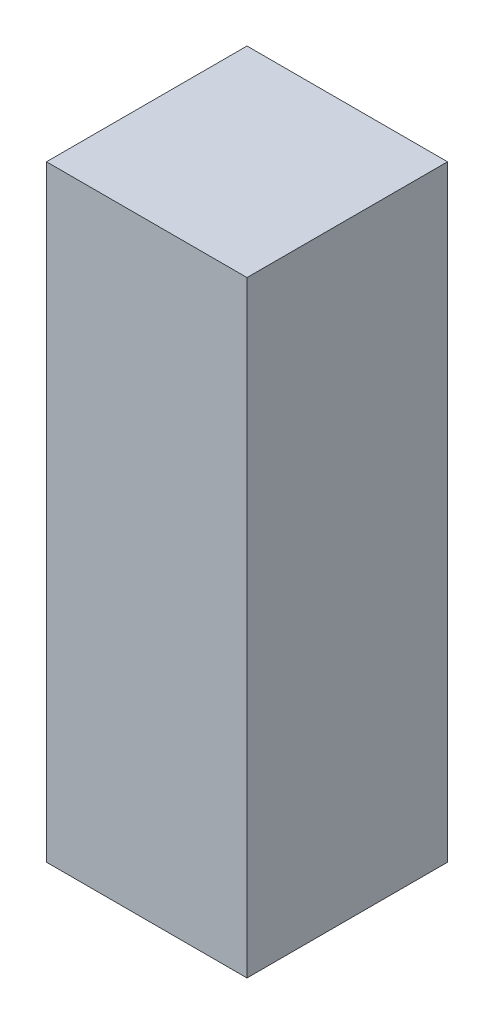
ISO-10303-21;
HEADER;
FILE_DESCRIPTION(('STEP AP214'),'2;1');
FILE_NAME('part.step','',(''),(''),'','','');
FILE_SCHEMA(('AUTOMOTIVE_DESIGN { 1 0 10303 214 1 1 1 1 }'));
ENDSEC;
DATA;
#1=APPLICATION_CONTEXT('core data for automotive mechanical design processes');
#2=APPLICATION_PROTOCOL_DEFINITION('international standard','automotive_design',2000,#1);
#3=PRODUCT_CONTEXT('',#1,'mechanical');
#4=PRODUCT('Part','Part','',(#3));
#5=PRODUCT_RELATED_PRODUCT_CATEGORY('part','',(#4));
#6=PRODUCT_DEFINITION_FORMATION('','',#4);
#7=PRODUCT_DEFINITION_CONTEXT('part definition',#1,'design');
#8=PRODUCT_DEFINITION('design','',#6,#7);
#9=PRODUCT_DEFINITION_SHAPE('','',#8);
#10=(LENGTH_UNIT() NAMED_UNIT(*) SI_UNIT(.MILLI.,.METRE.));
#11=(NAMED_UNIT(*) PLANE_ANGLE_UNIT() SI_UNIT($,.RADIAN.));
#12=(NAMED_UNIT(*) SI_UNIT($,.STERADIAN.) SOLID_ANGLE_UNIT());
#13=UNCERTAINTY_MEASURE_WITH_UNIT(LENGTH_MEASURE(1.E-05),#10,'distance_accuracy_value','');
#14=(GEOMETRIC_REPRESENTATION_CONTEXT(3) GLOBAL_UNCERTAINTY_ASSIGNED_CONTEXT((#13)) GLOBAL_UNIT_ASSIGNED_CONTEXT((#10,
#11,#12)) REPRESENTATION_CONTEXT('',''));
#15=CARTESIAN_POINT('',(0.,0.,0.));
#16=DIRECTION('',(0.,0.,1.));
#17=DIRECTION('',(1.,0.,0.));
#18=AXIS2_PLACEMENT_3D('',#15,#16,#17);
#19=CARTESIAN_POINT('',(0.,88.7855457419098,0.));
#20=DIRECTION('',(1.,0.,0.));
#21=DIRECTION('',(0.,0.,-1.));
#22=AXIS2_PLACEMENT_3D('',#19,#20,#21);
#23=PLANE('',#22);
#24=DIRECTION('',(0.,0.,1.));
#25=VECTOR('',#24,1.);
#26=CARTESIAN_POINT('',(0.,60.5012744944478,0.));
#27=LINE('',#26,#25);
#28=CARTESIAN_POINT('',(-1.11022302462516E-13,60.5012744944478,0.));
#29=VERTEX_POINT('',#28);
#30=CARTESIAN_POINT('',(-1.11022302462516E-13,60.5012744944478,20.));
#31=VERTEX_POINT('',#30);
#32=EDGE_CURVE('E38',#29,#31,#27,.T.);
#33=ORIENTED_EDGE('',*,*,#32,.F.);
#34=DIRECTION('',(0.,-1.,0.));
#35=VECTOR('',#34,1.);
#36=CARTESIAN_POINT('',(0.,88.7855457419098,0.));
#37=LINE('',#36,#35);
#38=CARTESIAN_POINT('',(0.,0.,0.));
#39=VERTEX_POINT('',#38);
#40=EDGE_CURVE('E92',#29,#39,#37,.T.);
#41=ORIENTED_EDGE('',*,*,#40,.T.);
#42=DIRECTION('',(0.,0.,1.));
#43=VECTOR('',#42,1.);
#44=CARTESIAN_POINT('',(0.,0.,0.));
#45=LINE('',#44,#43);
#46=CARTESIAN_POINT('',(0.,0.,20.));
#47=VERTEX_POINT('',#46);
#48=EDGE_CURVE('E87',#39,#47,#45,.T.);
#49=ORIENTED_EDGE('',*,*,#48,.T.);
#50=DIRECTION('',(0.,-1.,0.));
#51=VECTOR('',#50,1.);
#52=CARTESIAN_POINT('',(0.,88.7855457419098,20.));
#53=LINE('',#52,#51);
#54=EDGE_CURVE('E71',#31,#47,#53,.T.);
#55=ORIENTED_EDGE('',*,*,#54,.F.);
#56=EDGE_LOOP('',(#33,#41,#49,#55));
#57=FACE_BOUND('',#56,.T.);
#58=ADVANCED_FACE('F35',(#57),#23,.F.);
#59=CARTESIAN_POINT('',(0.,88.7855457419098,20.));
#60=DIRECTION('',(0.,0.,-1.));
#61=DIRECTION('',(-1.,0.,0.));
#62=AXIS2_PLACEMENT_3D('',#59,#60,#61);
#63=PLANE('',#62);
#64=DIRECTION('',(1.,0.,0.));
#65=VECTOR('',#64,1.);
#66=CARTESIAN_POINT('',(1.12355765706159E-13,60.5012744944478,20.));
#67=LINE('',#66,#65);
#68=CARTESIAN_POINT('',(20.,60.5012744944479,20.));
#69=VERTEX_POINT('',#68);
#70=EDGE_CURVE('E77',#31,#69,#67,.T.);
#71=ORIENTED_EDGE('',*,*,#70,.F.);
#72=ORIENTED_EDGE('',*,*,#54,.T.);
#73=DIRECTION('',(1.,0.,0.));
#74=VECTOR('',#73,1.);
#75=CARTESIAN_POINT('',(0.,0.,20.));
#76=LINE('',#75,#74);
#77=CARTESIAN_POINT('',(20.,0.,20.));
#78=VERTEX_POINT('',#77);
#79=EDGE_CURVE('E75',#47,#78,#76,.T.);
#80=ORIENTED_EDGE('',*,*,#79,.T.);
#81=DIRECTION('',(0.,-1.,0.));
#82=VECTOR('',#81,1.);
#83=CARTESIAN_POINT('',(20.,88.7855457419098,20.));
#84=LINE('',#83,#82);
#85=EDGE_CURVE('E81',#69,#78,#84,.T.);
#86=ORIENTED_EDGE('',*,*,#85,.F.);
#87=EDGE_LOOP('',(#71,#72,#80,#86));
#88=FACE_BOUND('',#87,.T.);
#89=ADVANCED_FACE('F73',(#88),#63,.F.);
#90=CARTESIAN_POINT('',(20.,88.7855457419098,0.));
#91=DIRECTION('',(-1.,0.,0.));
#92=DIRECTION('',(0.,0.,1.));
#93=AXIS2_PLACEMENT_3D('',#90,#91,#92);
#94=PLANE('',#93);
#95=DIRECTION('',(0.,0.,-1.));
#96=VECTOR('',#95,1.);
#97=CARTESIAN_POINT('',(20.,60.5012744944479,0.));
#98=LINE('',#97,#96);
#99=CARTESIAN_POINT('',(20.,60.5012744944478,0.));
#100=VERTEX_POINT('',#99);
#101=EDGE_CURVE('E80',#69,#100,#98,.T.);
#102=ORIENTED_EDGE('',*,*,#101,.F.);
#103=ORIENTED_EDGE('',*,*,#85,.T.);
#104=DIRECTION('',(0.,0.,-1.));
#105=VECTOR('',#104,1.);
#106=CARTESIAN_POINT('',(20.,0.,0.));
#107=LINE('',#106,#105);
#108=CARTESIAN_POINT('',(20.,0.,0.));
#109=VERTEX_POINT('',#108);
#110=EDGE_CURVE('E89',#78,#109,#107,.T.);
#111=ORIENTED_EDGE('',*,*,#110,.T.);
#112=DIRECTION('',(0.,-1.,0.));
#113=VECTOR('',#112,1.);
#114=CARTESIAN_POINT('',(20.,88.7855457419098,0.));
#115=LINE('',#114,#113);
#116=EDGE_CURVE('E101',#100,#109,#115,.T.);
#117=ORIENTED_EDGE('',*,*,#116,.F.);
#118=EDGE_LOOP('',(#102,#103,#111,#117));
#119=FACE_BOUND('',#118,.T.);
#120=ADVANCED_FACE('F107',(#119),#94,.F.);
#121=CARTESIAN_POINT('',(0.,88.7855457419098,0.));
#122=DIRECTION('',(0.,0.,1.));
#123=DIRECTION('',(1.,0.,0.));
#124=AXIS2_PLACEMENT_3D('',#121,#122,#123);
#125=PLANE('',#124);
#126=DIRECTION('',(-1.,0.,0.));
#127=VECTOR('',#126,1.);
#128=CARTESIAN_POINT('',(1.09906472107864E-13,60.5012744944478,0.));
#129=LINE('',#128,#127);
#130=EDGE_CURVE('E11',#100,#29,#129,.T.);
#131=ORIENTED_EDGE('',*,*,#130,.F.);
#132=ORIENTED_EDGE('',*,*,#116,.T.);
#133=DIRECTION('',(-1.,0.,0.));
#134=VECTOR('',#133,1.);
#135=CARTESIAN_POINT('',(0.,0.,0.));
#136=LINE('',#135,#134);
#137=EDGE_CURVE('E98',#109,#39,#136,.T.);
#138=ORIENTED_EDGE('',*,*,#137,.T.);
#139=ORIENTED_EDGE('',*,*,#40,.F.);
#140=EDGE_LOOP('',(#131,#132,#138,#139));
#141=FACE_BOUND('',#140,.T.);
#142=ADVANCED_FACE('F109',(#141),#125,.F.);
#143=CARTESIAN_POINT('',(0.,0.,0.));
#144=DIRECTION('',(0.,1.,0.));
#145=DIRECTION('',(0.,0.,1.));
#146=AXIS2_PLACEMENT_3D('',#143,#144,#145);
#147=PLANE('',#146);
#148=ORIENTED_EDGE('',*,*,#48,.F.);
#149=ORIENTED_EDGE('',*,*,#137,.F.);
#150=ORIENTED_EDGE('',*,*,#110,.F.);
#151=ORIENTED_EDGE('',*,*,#79,.F.);
#152=EDGE_LOOP('',(#148,#149,#150,#151));
#153=FACE_BOUND('',#152,.T.);
#154=ADVANCED_FACE('F85',(#153),#147,.F.);
#155=CARTESIAN_POINT('',(20.2999999999999,60.5012744944479,53.3306878685359));
#156=DIRECTION('',(0.,1.,0.));
#157=DIRECTION('',(-1.,0.,0.));
#158=AXIS2_PLACEMENT_3D('',#155,#156,#157);
#159=PLANE('',#158);
#160=ORIENTED_EDGE('',*,*,#101,.T.);
#161=ORIENTED_EDGE('',*,*,#130,.T.);
#162=ORIENTED_EDGE('',*,*,#32,.T.);
#163=ORIENTED_EDGE('',*,*,#70,.T.);
#164=EDGE_LOOP('',(#160,#161,#162,#163));
#165=FACE_BOUND('',#164,.T.);
#166=ADVANCED_FACE('F105',(#165),#159,.T.);
#167=CLOSED_SHELL('',(#58,#89,#120,#142,#154,#166));
#168=MANIFOLD_SOLID_BREP('B2',#167);
#169=ADVANCED_BREP_SHAPE_REPRESENTATION('',(#18,#168),#14);
#170=SHAPE_DEFINITION_REPRESENTATION(#9,#169);
ENDSEC;
END-ISO-10303-21;
